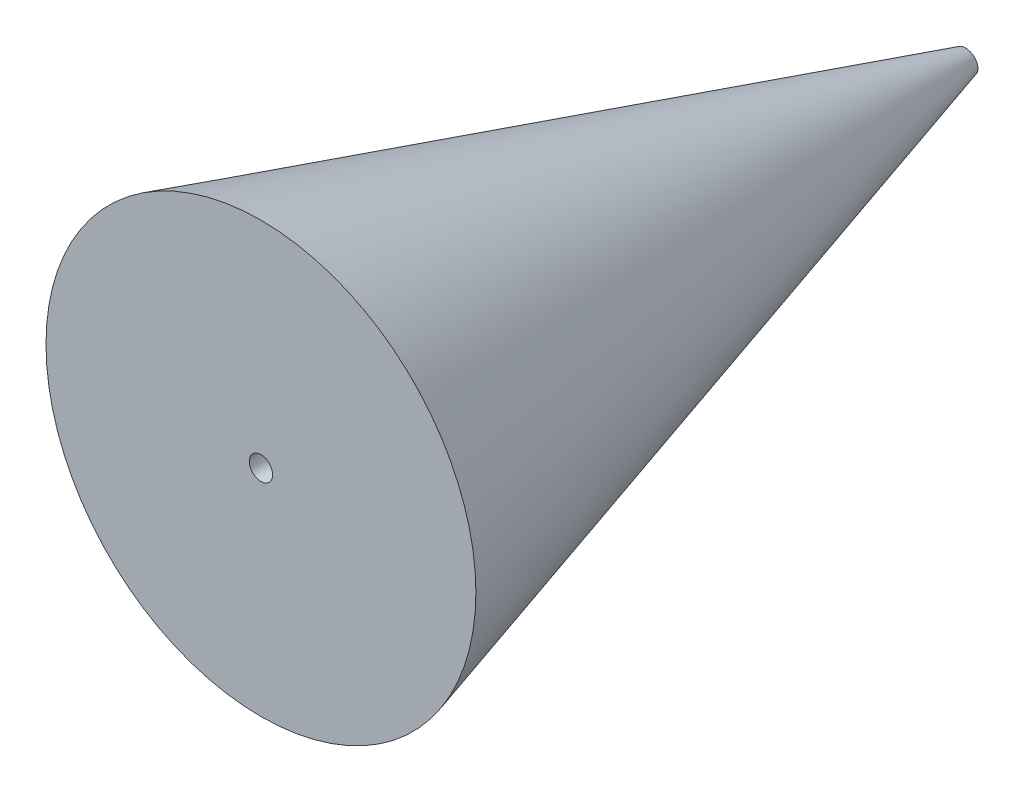
ISO-10303-21;
HEADER;
FILE_DESCRIPTION(('STEP AP214'),'2;1');
FILE_NAME('part.step','',(''),(''),'','','');
FILE_SCHEMA(('AUTOMOTIVE_DESIGN { 1 0 10303 214 1 1 1 1 }'));
ENDSEC;
DATA;
#1=APPLICATION_CONTEXT('core data for automotive mechanical design processes');
#2=APPLICATION_PROTOCOL_DEFINITION('international standard','automotive_design',2000,#1);
#3=PRODUCT_CONTEXT('',#1,'mechanical');
#4=PRODUCT('Part','Part','',(#3));
#5=PRODUCT_RELATED_PRODUCT_CATEGORY('part','',(#4));
#6=PRODUCT_DEFINITION_FORMATION('','',#4);
#7=PRODUCT_DEFINITION_CONTEXT('part definition',#1,'design');
#8=PRODUCT_DEFINITION('design','',#6,#7);
#9=PRODUCT_DEFINITION_SHAPE('','',#8);
#10=(LENGTH_UNIT() NAMED_UNIT(*) SI_UNIT(.MILLI.,.METRE.));
#11=(NAMED_UNIT(*) PLANE_ANGLE_UNIT() SI_UNIT($,.RADIAN.));
#12=(NAMED_UNIT(*) SI_UNIT($,.STERADIAN.) SOLID_ANGLE_UNIT());
#13=UNCERTAINTY_MEASURE_WITH_UNIT(LENGTH_MEASURE(1.E-05),#10,'distance_accuracy_value','');
#14=(GEOMETRIC_REPRESENTATION_CONTEXT(3) GLOBAL_UNCERTAINTY_ASSIGNED_CONTEXT((#13)) GLOBAL_UNIT_ASSIGNED_CONTEXT((#10,
#11,#12)) REPRESENTATION_CONTEXT('',''));
#15=CARTESIAN_POINT('',(0.,0.,0.));
#16=DIRECTION('',(0.,0.,1.));
#17=DIRECTION('',(1.,0.,0.));
#18=AXIS2_PLACEMENT_3D('',#15,#16,#17);
#19=CARTESIAN_POINT('',(0.0172118248083497,0.,0.));
#20=DIRECTION('',(0.,0.,1.));
#21=DIRECTION('',(1.,0.,0.));
#22=AXIS2_PLACEMENT_3D('',#19,#20,#21);
#23=CONICAL_SURFACE('',#22,58.5653242221907,0.280610274404837);
#24=CARTESIAN_POINT('',(0.0172118248083497,0.,0.));
#25=DIRECTION('',(0.,0.,1.));
#26=DIRECTION('',(1.,0.,0.));
#27=AXIS2_PLACEMENT_3D('',#24,#25,#26);
#28=CIRCLE('',#27,58.5653242221907);
#29=CARTESIAN_POINT('',(58.582536046999,0.,0.));
#30=VERTEX_POINT('',#29);
#31=EDGE_CURVE('E10',#30,#30,#28,.T.);
#32=ORIENTED_EDGE('',*,*,#31,.F.);
#33=EDGE_LOOP('',(#32));
#34=FACE_BOUND('',#33,.T.);
#35=CARTESIAN_POINT('',(-2.07996686018651,-2.31482795649571,-192.362425140411));
#36=CARTESIAN_POINT('',(-2.0016190150168,-2.3837556239922,-192.367705376828));
#37=CARTESIAN_POINT('',(-1.9198493101329,-2.448834819505,-192.372694661082));
#38=CARTESIAN_POINT('',(-1.75022843667271,-2.57067440435243,-192.382041126978));
#39=CARTESIAN_POINT('',(-1.6623734775705,-2.62742953873067,-192.386397909305));
#40=CARTESIAN_POINT('',(-1.48133134968942,-2.73209532525454,-192.394436641181));
#41=CARTESIAN_POINT('',(-1.38813650730297,-2.77999280877685,-192.398117585907));
#42=CARTESIAN_POINT('',(-1.19744568560751,-2.86637321938718,-192.404758711191));
#43=CARTESIAN_POINT('',(-1.09994815328308,-2.90485271378954,-192.407718628946));
#44=CARTESIAN_POINT('',(-0.831770228627338,-2.99560810496717,-192.414701805494));
#45=CARTESIAN_POINT('',(-0.657814641366262,-3.03857340555673,-192.418010347372));
#46=CARTESIAN_POINT('',(-0.305376277128073,-3.09464299718488,-192.422328594048));
#47=CARTESIAN_POINT('',(-0.126897954474792,-3.10777559594152,-192.423340478102));
#48=CARTESIAN_POINT('',(0.229448199496226,-3.10392991717247,-192.42304421605));
#49=CARTESIAN_POINT('',(0.407316552831244,-3.08700268116405,-192.42174000267));
#50=CARTESIAN_POINT('',(0.757700950629575,-3.02360871491859,-192.416858065374));
#51=CARTESIAN_POINT('',(0.930216121294706,-2.97713718850281,-192.41327997232));
#52=CARTESIAN_POINT('',(1.26496648394984,-2.8559990680115,-192.403960417093));
#53=CARTESIAN_POINT('',(1.42720254334719,-2.78133485669859,-192.398219137745));
#54=CARTESIAN_POINT('',(1.73682788859141,-2.60595658977581,-192.384748098786));
#55=CARTESIAN_POINT('',(1.88421730850367,-2.50524276942361,-192.377018357133));
#56=CARTESIAN_POINT('',(2.16026570975793,-2.28043702926294,-192.359787507306));
#57=CARTESIAN_POINT('',(2.28888999317224,-2.15630275122814,-192.350283189965));
#58=CARTESIAN_POINT('',(2.52348231828577,-1.88831607008676,-192.329796275072));
#59=CARTESIAN_POINT('',(2.62945010837479,-1.74446344802851,-192.318813661107));
#60=CARTESIAN_POINT('',(2.81603693802755,-1.44069240133934,-192.295661013993));
#61=CARTESIAN_POINT('',(2.89658432267691,-1.28073020990573,-192.283487748788));
#62=CARTESIAN_POINT('',(3.02968033385077,-0.949612179811677,-192.258334697139));
#63=CARTESIAN_POINT('',(3.08222846238912,-0.778456142121709,-192.245354896353));
#64=CARTESIAN_POINT('',(3.15795854647667,-0.429349313652765,-192.218929040342));
#65=CARTESIAN_POINT('',(3.18106678690392,-0.251382611476528,-192.205481900993));
#66=CARTESIAN_POINT('',(3.197029088604,0.105899068271525,-192.17853587669));
#67=CARTESIAN_POINT('',(3.18988292647244,0.285214055789582,-192.165036991354));
#68=CARTESIAN_POINT('',(3.14550826123666,0.640311401857176,-192.138353406317));
#69=CARTESIAN_POINT('',(3.10824634137994,0.816089613788615,-192.125169072385));
#70=CARTESIAN_POINT('',(3.00463716371676,1.15890931418655,-192.099499545591));
#71=CARTESIAN_POINT('',(2.93828992889108,1.32595080955596,-192.087014352177));
#72=CARTESIAN_POINT('',(2.77842722056187,1.64641654870221,-192.063099046469));
#73=CARTESIAN_POINT('',(2.6849313528751,1.7998505153548,-192.051668180599));
#74=CARTESIAN_POINT('',(2.47338260734671,2.0888448543944,-192.030167448894));
#75=CARTESIAN_POINT('',(2.35532998573909,2.22440541325484,-192.02009756886));
#76=CARTESIAN_POINT('',(2.09828914662815,2.47348101771636,-192.001616527696));
#77=CARTESIAN_POINT('',(1.95934726804992,2.58704361660738,-191.993201788004));
#78=CARTESIAN_POINT('',(1.66427452854524,2.78922071502005,-191.978234159513));
#79=CARTESIAN_POINT('',(1.50814391981009,2.87783558050445,-191.971681243403));
#80=CARTESIAN_POINT('',(1.18357587510665,3.02735254728015,-191.960631444862));
#81=CARTESIAN_POINT('',(1.01517258220646,3.0883283639131,-191.956129093274));
#82=CARTESIAN_POINT('',(0.670479789684666,3.18115379635481,-191.94927718697));
#83=CARTESIAN_POINT('',(0.494190393099463,3.21300379259239,-191.946927604136));
#84=CARTESIAN_POINT('',(0.139114890012289,3.24662129180002,-191.944447677005));
#85=CARTESIAN_POINT('',(-0.0396653919284396,3.24845000840766,-191.94431281687));
#86=CARTESIAN_POINT('',(-0.394992547968425,3.2221295367893,-191.946254380737));
#87=CARTESIAN_POINT('',(-0.57153943340718,3.19398050082954,-191.948330793508));
#88=CARTESIAN_POINT('',(-0.917289834429242,3.10854102516636,-191.954636822471));
#89=CARTESIAN_POINT('',(-1.08649734913946,3.05126667757006,-191.95886524965));
#90=CARTESIAN_POINT('',(-1.41288468878058,2.90923298885708,-191.969360106998));
#91=CARTESIAN_POINT('',(-1.57006448634555,2.82447358520763,-191.975626541804));
#92=CARTESIAN_POINT('',(-1.86813844604548,2.62978545107993,-191.990036030786));
#93=CARTESIAN_POINT('',(-2.00901357747243,2.51982774642424,-191.998181245341));
#94=CARTESIAN_POINT('',(-2.27030899341986,2.27793965070825,-192.016123059015));
#95=CARTESIAN_POINT('',(-2.39072899289108,2.14600895349752,-192.025919681144));
#96=CARTESIAN_POINT('',(-2.6080063941545,1.86358772007949,-192.046922897915));
#97=CARTESIAN_POINT('',(-2.70480688646843,1.71305364852557,-192.05813280118));
#98=CARTESIAN_POINT('',(-2.87176944607405,1.39795110205039,-192.081636951468));
#99=CARTESIAN_POINT('',(-2.94193100682186,1.23338236033032,-192.093931219104));
#100=CARTESIAN_POINT('',(-3.05381382428601,0.894413083304707,-192.119299313102));
#101=CARTESIAN_POINT('',(-3.09545885350481,0.719987535030873,-192.13237512808));
#102=CARTESIAN_POINT('',(-3.14884647472129,0.366657698928177,-192.158911342966));
#103=CARTESIAN_POINT('',(-3.16059058560899,0.187753639062449,-192.172371723306));
#104=CARTESIAN_POINT('',(-3.15385286297379,-0.169768993720231,-192.199320807064));
#105=CARTESIAN_POINT('',(-3.13532280159524,-0.348386656499965,-192.21280952142));
#106=CARTESIAN_POINT('',(-3.06844394510067,-0.700057173195338,-192.23941476878));
#107=CARTESIAN_POINT('',(-3.02008366758365,-0.873107857239741,-192.252531156431));
#108=CARTESIAN_POINT('',(-2.89486239407578,-1.20876041485094,-192.278015503954));
#109=CARTESIAN_POINT('',(-2.81797872859942,-1.37135385640239,-192.290382859399));
#110=CARTESIAN_POINT('',(-2.63794627458496,-1.68110453764671,-192.313980310987));
#111=CARTESIAN_POINT('',(-2.534845628463,-1.82828938030819,-192.325212439484));
#112=CARTESIAN_POINT('',(-2.36809149566006,-2.0280801468624,-192.340479843015));
#113=CARTESIAN_POINT('',(-2.31359230722668,-2.08848733072484,-192.345099136333));
#114=CARTESIAN_POINT('',(-2.20007893265391,-2.20498666894314,-192.354013045272));
#115=CARTESIAN_POINT('',(-2.14106331999567,-2.26107744864426,-192.358307557453));
#116=CARTESIAN_POINT('',(-2.07996686018651,-2.31482795649571,-192.362425140411));
#117=B_SPLINE_CURVE_WITH_KNOTS('',3,(#35,#36,#37,#38,#39,#40,#41,#42,#43,#44,#45,#46,#47,#48,
#49,#50,#51,#52,#53,#54,#55,#56,#57,#58,#59,#60,#61,#62,#63,#64,#65,#66,#67,#68,#69,#70,#71,#72,
#73,#74,#75,#76,#77,#78,#79,#80,#81,#82,#83,#84,#85,#86,#87,#88,#89,#90,#91,#92,#93,#94,#95,#96,
#97,#98,#99,#100,#101,#102,#103,#104,#105,#106,#107,#108,#109,#110,#111,#112,#113,#114,#115,
#116),.UNSPECIFIED.,.T.,.F.,(4,2,2,2,2,2,2,2,2,2,2,2,2,2,2,2,2,2,2,2,2,2,2,2,2,2,2,2,2,2,2,2,2,
2,2,2,2,2,2,2,4),(0.,0.31335099643412,0.626898966780041,0.940909404173561,1.25503412278645,
1.7899304823409,2.32431907590415,2.85780114653162,3.39136984401358,3.92489345593207,
4.45841224969222,4.9929053791776,5.52740444413331,6.06339696694878,6.59939902244414,
7.13674056322276,7.67408607184264,8.2120286444605,8.74997079204188,9.28752541823484,
9.82507443567117,10.3614481307283,10.897813957214,11.432740716384,11.9676604884737,
12.5014894189409,13.0353156379395,13.5688472310679,14.102380038072,14.6365294317366,
15.1706862683451,15.706117682162,16.2415592767896,16.7784266299672,17.3152667111149,
17.8529628321763,18.3908660552781,18.929197705875,19.4665478645686,19.7108247355774,
19.9551790827624),.UNSPECIFIED.);
#118=CARTESIAN_POINT('',(-2.07996686018651,-2.31482795649571,-192.362425140411));
#119=VERTEX_POINT('',#118);
#120=EDGE_CURVE('E41',#119,#119,#117,.T.);
#121=ORIENTED_EDGE('',*,*,#120,.T.);
#122=EDGE_LOOP('',(#121));
#123=FACE_BOUND('',#122,.T.);
#124=ADVANCED_FACE('F37',(#34,#123),#23,.T.);
#125=CARTESIAN_POINT('',(0.0172118248083497,0.,0.));
#126=DIRECTION('',(0.,0.,1.));
#127=DIRECTION('',(1.,0.,0.));
#128=AXIS2_PLACEMENT_3D('',#125,#126,#127);
#129=PLANE('',#128);
#130=CARTESIAN_POINT('',(0.0172118248083497,0.0689645183651368,0.));
#131=DIRECTION('',(0.,0.,1.));
#132=DIRECTION('',(1.,0.,0.));
#133=AXIS2_PLACEMENT_3D('',#130,#131,#132);
#134=CIRCLE('',#133,3.175);
#135=CARTESIAN_POINT('',(3.19221182480835,0.0689645183651368,0.));
#136=VERTEX_POINT('',#135);
#137=EDGE_CURVE('E50',#136,#136,#134,.F.);
#138=ORIENTED_EDGE('',*,*,#137,.T.);
#139=EDGE_LOOP('',(#138));
#140=FACE_BOUND('',#139,.T.);
#141=ORIENTED_EDGE('',*,*,#31,.T.);
#142=EDGE_LOOP('',(#141));
#143=FACE_BOUND('',#142,.T.);
#144=ADVANCED_FACE('F39',(#140,#143),#129,.T.);
#145=CARTESIAN_POINT('',(0.0172118248083497,0.0689645183651368,1.2E-05));
#146=DIRECTION('',(0.,0.,-1.));
#147=DIRECTION('',(-1.,0.,0.));
#148=AXIS2_PLACEMENT_3D('',#145,#146,#147);
#149=CYLINDRICAL_SURFACE('',#148,3.175);
#150=ORIENTED_EDGE('',*,*,#137,.F.);
#151=EDGE_LOOP('',(#150));
#152=FACE_BOUND('',#151,.T.);
#153=ORIENTED_EDGE('',*,*,#120,.F.);
#154=EDGE_LOOP('',(#153));
#155=FACE_BOUND('',#154,.T.);
#156=ADVANCED_FACE('F63',(#152,#155),#149,.F.);
#157=CLOSED_SHELL('',(#124,#144,#156));
#158=MANIFOLD_SOLID_BREP('B2',#157);
#159=ADVANCED_BREP_SHAPE_REPRESENTATION('',(#18,#158),#14);
#160=SHAPE_DEFINITION_REPRESENTATION(#9,#159);
ENDSEC;
END-ISO-10303-21;
